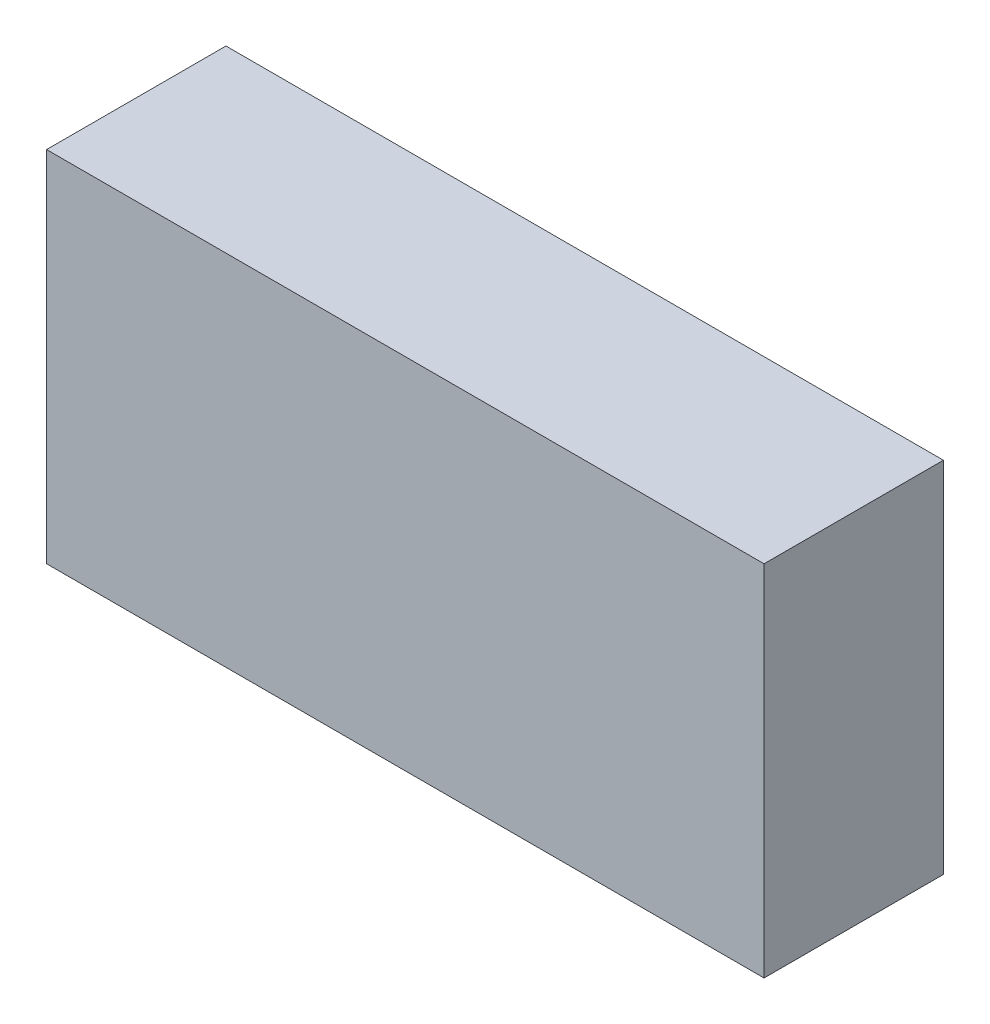
ISO-10303-21;
HEADER;
FILE_DESCRIPTION(('STEP AP214'),'2;1');
FILE_NAME('part.step','',(''),(''),'','','');
FILE_SCHEMA(('AUTOMOTIVE_DESIGN { 1 0 10303 214 1 1 1 1 }'));
ENDSEC;
DATA;
#1=APPLICATION_CONTEXT('core data for automotive mechanical design processes');
#2=APPLICATION_PROTOCOL_DEFINITION('international standard','automotive_design',2000,#1);
#3=PRODUCT_CONTEXT('',#1,'mechanical');
#4=PRODUCT('Part','Part','',(#3));
#5=PRODUCT_RELATED_PRODUCT_CATEGORY('part','',(#4));
#6=PRODUCT_DEFINITION_FORMATION('','',#4);
#7=PRODUCT_DEFINITION_CONTEXT('part definition',#1,'design');
#8=PRODUCT_DEFINITION('design','',#6,#7);
#9=PRODUCT_DEFINITION_SHAPE('','',#8);
#10=(LENGTH_UNIT() NAMED_UNIT(*) SI_UNIT(.MILLI.,.METRE.));
#11=(NAMED_UNIT(*) PLANE_ANGLE_UNIT() SI_UNIT($,.RADIAN.));
#12=(NAMED_UNIT(*) SI_UNIT($,.STERADIAN.) SOLID_ANGLE_UNIT());
#13=UNCERTAINTY_MEASURE_WITH_UNIT(LENGTH_MEASURE(1.E-05),#10,'distance_accuracy_value','');
#14=(GEOMETRIC_REPRESENTATION_CONTEXT(3) GLOBAL_UNCERTAINTY_ASSIGNED_CONTEXT((#13)) GLOBAL_UNIT_ASSIGNED_CONTEXT((#10,
#11,#12)) REPRESENTATION_CONTEXT('',''));
#15=CARTESIAN_POINT('',(0.,0.,0.));
#16=DIRECTION('',(0.,0.,1.));
#17=DIRECTION('',(1.,0.,0.));
#18=AXIS2_PLACEMENT_3D('',#15,#16,#17);
#19=CARTESIAN_POINT('',(-20000.,-10000.,-10000.));
#20=DIRECTION('',(-1.,0.,0.));
#21=DIRECTION('',(0.,0.,1.));
#22=AXIS2_PLACEMENT_3D('',#19,#20,#21);
#23=PLANE('',#22);
#24=DIRECTION('',(0.,-1.,0.));
#25=VECTOR('',#24,1.);
#26=CARTESIAN_POINT('',(-20000.,-10000.,0.));
#27=LINE('',#26,#25);
#28=CARTESIAN_POINT('',(-20000.,10000.,0.));
#29=VERTEX_POINT('',#28);
#30=CARTESIAN_POINT('',(-20000.,-10000.,0.));
#31=VERTEX_POINT('',#30);
#32=EDGE_CURVE('E104',#29,#31,#27,.T.);
#33=ORIENTED_EDGE('',*,*,#32,.F.);
#34=DIRECTION('',(0.,0.,1.));
#35=VECTOR('',#34,1.);
#36=CARTESIAN_POINT('',(-20000.,10000.,-10000.));
#37=LINE('',#36,#35);
#38=CARTESIAN_POINT('',(-20000.,10000.,-10000.));
#39=VERTEX_POINT('',#38);
#40=EDGE_CURVE('E11',#39,#29,#37,.T.);
#41=ORIENTED_EDGE('',*,*,#40,.F.);
#42=DIRECTION('',(0.,-1.,0.));
#43=VECTOR('',#42,1.);
#44=CARTESIAN_POINT('',(-20000.,-10000.,-10000.));
#45=LINE('',#44,#43);
#46=CARTESIAN_POINT('',(-20000.,-10000.,-10000.));
#47=VERTEX_POINT('',#46);
#48=EDGE_CURVE('E97',#39,#47,#45,.T.);
#49=ORIENTED_EDGE('',*,*,#48,.T.);
#50=DIRECTION('',(0.,0.,1.));
#51=VECTOR('',#50,1.);
#52=CARTESIAN_POINT('',(-20000.,-10000.,-10000.));
#53=LINE('',#52,#51);
#54=EDGE_CURVE('E42',#47,#31,#53,.T.);
#55=ORIENTED_EDGE('',*,*,#54,.T.);
#56=EDGE_LOOP('',(#33,#41,#49,#55));
#57=FACE_BOUND('',#56,.T.);
#58=ADVANCED_FACE('F41',(#57),#23,.T.);
#59=CARTESIAN_POINT('',(-20000.,10000.,-10000.));
#60=DIRECTION('',(0.,1.,0.));
#61=DIRECTION('',(0.,0.,1.));
#62=AXIS2_PLACEMENT_3D('',#59,#60,#61);
#63=PLANE('',#62);
#64=DIRECTION('',(-1.,0.,0.));
#65=VECTOR('',#64,1.);
#66=CARTESIAN_POINT('',(-20000.,10000.,0.));
#67=LINE('',#66,#65);
#68=CARTESIAN_POINT('',(20000.,10000.,0.));
#69=VERTEX_POINT('',#68);
#70=EDGE_CURVE('E101',#69,#29,#67,.T.);
#71=ORIENTED_EDGE('',*,*,#70,.F.);
#72=DIRECTION('',(0.,0.,1.));
#73=VECTOR('',#72,1.);
#74=CARTESIAN_POINT('',(20000.,10000.,-10000.));
#75=LINE('',#74,#73);
#76=CARTESIAN_POINT('',(20000.,10000.,-10000.));
#77=VERTEX_POINT('',#76);
#78=EDGE_CURVE('E49',#77,#69,#75,.T.);
#79=ORIENTED_EDGE('',*,*,#78,.F.);
#80=DIRECTION('',(-1.,0.,0.));
#81=VECTOR('',#80,1.);
#82=CARTESIAN_POINT('',(-20000.,10000.,-10000.));
#83=LINE('',#82,#81);
#84=EDGE_CURVE('E96',#77,#39,#83,.T.);
#85=ORIENTED_EDGE('',*,*,#84,.T.);
#86=ORIENTED_EDGE('',*,*,#40,.T.);
#87=EDGE_LOOP('',(#71,#79,#85,#86));
#88=FACE_BOUND('',#87,.T.);
#89=ADVANCED_FACE('F113',(#88),#63,.T.);
#90=CARTESIAN_POINT('',(20000.,-10000.,-10000.));
#91=DIRECTION('',(1.,0.,0.));
#92=DIRECTION('',(0.,0.,-1.));
#93=AXIS2_PLACEMENT_3D('',#90,#91,#92);
#94=PLANE('',#93);
#95=DIRECTION('',(0.,1.,0.));
#96=VECTOR('',#95,1.);
#97=CARTESIAN_POINT('',(20000.,-10000.,0.));
#98=LINE('',#97,#96);
#99=CARTESIAN_POINT('',(20000.,-10000.,0.));
#100=VERTEX_POINT('',#99);
#101=EDGE_CURVE('E93',#100,#69,#98,.T.);
#102=ORIENTED_EDGE('',*,*,#101,.F.);
#103=DIRECTION('',(0.,0.,1.));
#104=VECTOR('',#103,1.);
#105=CARTESIAN_POINT('',(20000.,-10000.,-10000.));
#106=LINE('',#105,#104);
#107=CARTESIAN_POINT('',(20000.,-10000.,-10000.));
#108=VERTEX_POINT('',#107);
#109=EDGE_CURVE('E88',#108,#100,#106,.T.);
#110=ORIENTED_EDGE('',*,*,#109,.F.);
#111=DIRECTION('',(0.,1.,0.));
#112=VECTOR('',#111,1.);
#113=CARTESIAN_POINT('',(20000.,-10000.,-10000.));
#114=LINE('',#113,#112);
#115=EDGE_CURVE('E90',#108,#77,#114,.T.);
#116=ORIENTED_EDGE('',*,*,#115,.T.);
#117=ORIENTED_EDGE('',*,*,#78,.T.);
#118=EDGE_LOOP('',(#102,#110,#116,#117));
#119=FACE_BOUND('',#118,.T.);
#120=ADVANCED_FACE('F86',(#119),#94,.T.);
#121=CARTESIAN_POINT('',(-20000.,-10000.,-10000.));
#122=DIRECTION('',(0.,-1.,0.));
#123=DIRECTION('',(0.,0.,-1.));
#124=AXIS2_PLACEMENT_3D('',#121,#122,#123);
#125=PLANE('',#124);
#126=DIRECTION('',(1.,0.,0.));
#127=VECTOR('',#126,1.);
#128=CARTESIAN_POINT('',(-20000.,-10000.,0.));
#129=LINE('',#128,#127);
#130=EDGE_CURVE('E107',#31,#100,#129,.T.);
#131=ORIENTED_EDGE('',*,*,#130,.F.);
#132=ORIENTED_EDGE('',*,*,#54,.F.);
#133=DIRECTION('',(1.,0.,0.));
#134=VECTOR('',#133,1.);
#135=CARTESIAN_POINT('',(-20000.,-10000.,-10000.));
#136=LINE('',#135,#134);
#137=EDGE_CURVE('E92',#47,#108,#136,.T.);
#138=ORIENTED_EDGE('',*,*,#137,.T.);
#139=ORIENTED_EDGE('',*,*,#109,.T.);
#140=EDGE_LOOP('',(#131,#132,#138,#139));
#141=FACE_BOUND('',#140,.T.);
#142=ADVANCED_FACE('F98',(#141),#125,.T.);
#143=CARTESIAN_POINT('',(0.,0.,-10000.));
#144=DIRECTION('',(0.,0.,-1.));
#145=DIRECTION('',(-1.,0.,0.));
#146=AXIS2_PLACEMENT_3D('',#143,#144,#145);
#147=PLANE('',#146);
#148=ORIENTED_EDGE('',*,*,#48,.F.);
#149=ORIENTED_EDGE('',*,*,#84,.F.);
#150=ORIENTED_EDGE('',*,*,#115,.F.);
#151=ORIENTED_EDGE('',*,*,#137,.F.);
#152=EDGE_LOOP('',(#148,#149,#150,#151));
#153=FACE_BOUND('',#152,.T.);
#154=ADVANCED_FACE('F94',(#153),#147,.T.);
#155=CARTESIAN_POINT('',(0.,0.,0.));
#156=DIRECTION('',(0.,0.,-1.));
#157=DIRECTION('',(-1.,0.,0.));
#158=AXIS2_PLACEMENT_3D('',#155,#156,#157);
#159=PLANE('',#158);
#160=ORIENTED_EDGE('',*,*,#32,.T.);
#161=ORIENTED_EDGE('',*,*,#130,.T.);
#162=ORIENTED_EDGE('',*,*,#101,.T.);
#163=ORIENTED_EDGE('',*,*,#70,.T.);
#164=EDGE_LOOP('',(#160,#161,#162,#163));
#165=FACE_BOUND('',#164,.T.);
#166=ADVANCED_FACE('F111',(#165),#159,.F.);
#167=CLOSED_SHELL('',(#58,#89,#120,#142,#154,#166));
#168=MANIFOLD_SOLID_BREP('B2',#167);
#169=ADVANCED_BREP_SHAPE_REPRESENTATION('',(#18,#168),#14);
#170=SHAPE_DEFINITION_REPRESENTATION(#9,#169);
ENDSEC;
END-ISO-10303-21;
